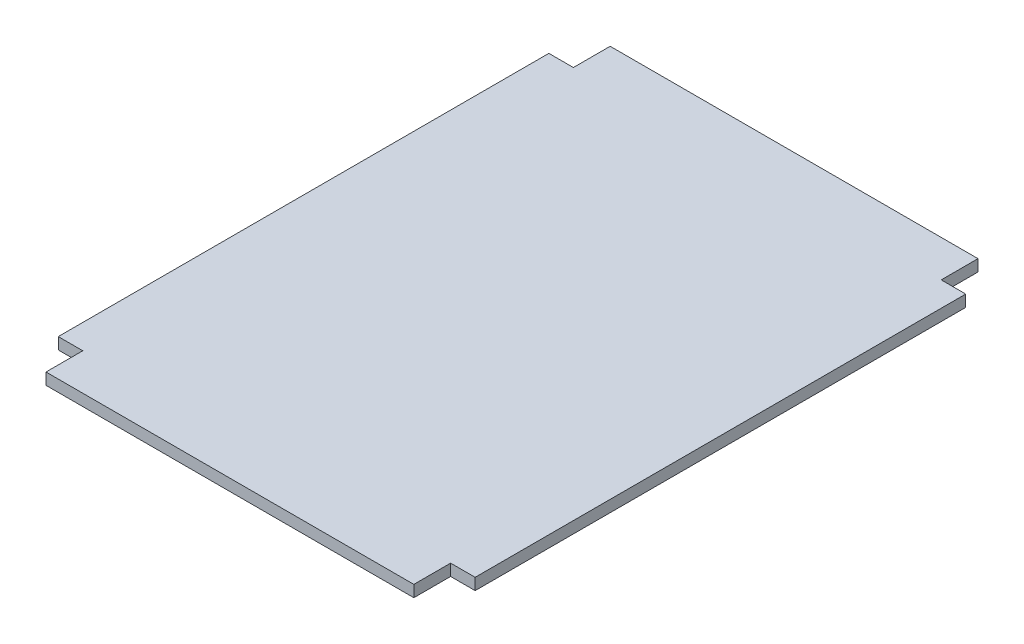
ISO-10303-21;
HEADER;
FILE_DESCRIPTION(('STEP AP214'),'2;1');
FILE_NAME('part.step','',(''),(''),'','','');
FILE_SCHEMA(('AUTOMOTIVE_DESIGN { 1 0 10303 214 1 1 1 1 }'));
ENDSEC;
DATA;
#1=APPLICATION_CONTEXT('core data for automotive mechanical design processes');
#2=APPLICATION_PROTOCOL_DEFINITION('international standard','automotive_design',2000,#1);
#3=PRODUCT_CONTEXT('',#1,'mechanical');
#4=PRODUCT('Part','Part','',(#3));
#5=PRODUCT_RELATED_PRODUCT_CATEGORY('part','',(#4));
#6=PRODUCT_DEFINITION_FORMATION('','',#4);
#7=PRODUCT_DEFINITION_CONTEXT('part definition',#1,'design');
#8=PRODUCT_DEFINITION('design','',#6,#7);
#9=PRODUCT_DEFINITION_SHAPE('','',#8);
#10=(LENGTH_UNIT() NAMED_UNIT(*) SI_UNIT(.MILLI.,.METRE.));
#11=(NAMED_UNIT(*) PLANE_ANGLE_UNIT() SI_UNIT($,.RADIAN.));
#12=(NAMED_UNIT(*) SI_UNIT($,.STERADIAN.) SOLID_ANGLE_UNIT());
#13=UNCERTAINTY_MEASURE_WITH_UNIT(LENGTH_MEASURE(1.E-05),#10,'distance_accuracy_value','');
#14=(GEOMETRIC_REPRESENTATION_CONTEXT(3) GLOBAL_UNCERTAINTY_ASSIGNED_CONTEXT((#13)) GLOBAL_UNIT_ASSIGNED_CONTEXT((#10,
#11,#12)) REPRESENTATION_CONTEXT('',''));
#15=CARTESIAN_POINT('',(0.,0.,0.));
#16=DIRECTION('',(0.,0.,1.));
#17=DIRECTION('',(1.,0.,0.));
#18=AXIS2_PLACEMENT_3D('',#15,#16,#17);
#19=CARTESIAN_POINT('',(0.,2.9972,-73.025));
#20=DIRECTION('',(0.,0.,1.));
#21=DIRECTION('',(1.,0.,0.));
#22=AXIS2_PLACEMENT_3D('',#19,#20,#21);
#23=PLANE('',#22);
#24=DIRECTION('',(-1.,0.,0.));
#25=VECTOR('',#24,1.);
#26=CARTESIAN_POINT('',(0.,0.,-73.025));
#27=LINE('',#26,#25);
#28=CARTESIAN_POINT('',(47.6123,0.,-73.025));
#29=VERTEX_POINT('',#28);
#30=CARTESIAN_POINT('',(-47.6122999999999,0.,-73.025));
#31=VERTEX_POINT('',#30);
#32=EDGE_CURVE('E156',#29,#31,#27,.T.);
#33=ORIENTED_EDGE('',*,*,#32,.T.);
#34=DIRECTION('',(0.,-1.,0.));
#35=VECTOR('',#34,1.);
#36=CARTESIAN_POINT('',(-47.6122999999999,2.9972,-73.025));
#37=LINE('',#36,#35);
#38=CARTESIAN_POINT('',(-47.6122999999999,2.9972,-73.025));
#39=VERTEX_POINT('',#38);
#40=EDGE_CURVE('E11',#39,#31,#37,.T.);
#41=ORIENTED_EDGE('',*,*,#40,.F.);
#42=DIRECTION('',(-1.,0.,0.));
#43=VECTOR('',#42,1.);
#44=CARTESIAN_POINT('',(0.,2.9972,-73.025));
#45=LINE('',#44,#43);
#46=CARTESIAN_POINT('',(47.6123,2.9972,-73.025));
#47=VERTEX_POINT('',#46);
#48=EDGE_CURVE('E188',#47,#39,#45,.T.);
#49=ORIENTED_EDGE('',*,*,#48,.F.);
#50=DIRECTION('',(0.,-1.,0.));
#51=VECTOR('',#50,1.);
#52=CARTESIAN_POINT('',(47.6123,2.9972,-73.025));
#53=LINE('',#52,#51);
#54=EDGE_CURVE('E52',#47,#29,#53,.T.);
#55=ORIENTED_EDGE('',*,*,#54,.T.);
#56=EDGE_LOOP('',(#33,#41,#49,#55));
#57=FACE_BOUND('',#56,.T.);
#58=ADVANCED_FACE('F36',(#57),#23,.F.);
#59=CARTESIAN_POINT('',(-47.6122999999999,2.9972,0.));
#60=DIRECTION('',(1.,0.,0.));
#61=DIRECTION('',(0.,0.,-1.));
#62=AXIS2_PLACEMENT_3D('',#59,#60,#61);
#63=PLANE('',#62);
#64=DIRECTION('',(0.,0.,1.));
#65=VECTOR('',#64,1.);
#66=CARTESIAN_POINT('',(-47.6122999999999,0.,0.));
#67=LINE('',#66,#65);
#68=CARTESIAN_POINT('',(-47.6122999999999,0.,-63.5));
#69=VERTEX_POINT('',#68);
#70=EDGE_CURVE('E158',#31,#69,#67,.T.);
#71=ORIENTED_EDGE('',*,*,#70,.T.);
#72=DIRECTION('',(0.,-1.,0.));
#73=VECTOR('',#72,1.);
#74=CARTESIAN_POINT('',(-47.6122999999999,2.9972,-63.5));
#75=LINE('',#74,#73);
#76=CARTESIAN_POINT('',(-47.6122999999999,2.9972,-63.5));
#77=VERTEX_POINT('',#76);
#78=EDGE_CURVE('E44',#77,#69,#75,.T.);
#79=ORIENTED_EDGE('',*,*,#78,.F.);
#80=DIRECTION('',(0.,0.,1.));
#81=VECTOR('',#80,1.);
#82=CARTESIAN_POINT('',(-47.6122999999999,2.9972,0.));
#83=LINE('',#82,#81);
#84=EDGE_CURVE('E103',#39,#77,#83,.T.);
#85=ORIENTED_EDGE('',*,*,#84,.F.);
#86=ORIENTED_EDGE('',*,*,#40,.T.);
#87=EDGE_LOOP('',(#71,#79,#85,#86));
#88=FACE_BOUND('',#87,.T.);
#89=ADVANCED_FACE('F209',(#88),#63,.F.);
#90=CARTESIAN_POINT('',(0.,2.9972,-63.5));
#91=DIRECTION('',(0.,0.,-1.));
#92=DIRECTION('',(-1.,0.,0.));
#93=AXIS2_PLACEMENT_3D('',#90,#91,#92);
#94=PLANE('',#93);
#95=DIRECTION('',(1.,0.,0.));
#96=VECTOR('',#95,1.);
#97=CARTESIAN_POINT('',(0.,0.,-63.5));
#98=LINE('',#97,#96);
#99=CARTESIAN_POINT('',(-53.9622999999999,0.,-63.5));
#100=VERTEX_POINT('',#99);
#101=EDGE_CURVE('E161',#100,#69,#98,.T.);
#102=ORIENTED_EDGE('',*,*,#101,.F.);
#103=DIRECTION('',(0.,-1.,0.));
#104=VECTOR('',#103,1.);
#105=CARTESIAN_POINT('',(-53.9622999999999,2.9972,-63.5));
#106=LINE('',#105,#104);
#107=CARTESIAN_POINT('',(-53.9622999999999,2.9972,-63.5));
#108=VERTEX_POINT('',#107);
#109=EDGE_CURVE('E202',#108,#100,#106,.T.);
#110=ORIENTED_EDGE('',*,*,#109,.F.);
#111=DIRECTION('',(1.,0.,0.));
#112=VECTOR('',#111,1.);
#113=CARTESIAN_POINT('',(0.,2.9972,-63.5));
#114=LINE('',#113,#112);
#115=EDGE_CURVE('E208',#108,#77,#114,.T.);
#116=ORIENTED_EDGE('',*,*,#115,.T.);
#117=ORIENTED_EDGE('',*,*,#78,.T.);
#118=EDGE_LOOP('',(#102,#110,#116,#117));
#119=FACE_BOUND('',#118,.T.);
#120=ADVANCED_FACE('F206',(#119),#94,.T.);
#121=CARTESIAN_POINT('',(-53.9622999999999,2.9972,0.));
#122=DIRECTION('',(-1.,0.,0.));
#123=DIRECTION('',(0.,0.,1.));
#124=AXIS2_PLACEMENT_3D('',#121,#122,#123);
#125=PLANE('',#124);
#126=DIRECTION('',(0.,0.,-1.));
#127=VECTOR('',#126,1.);
#128=CARTESIAN_POINT('',(-53.9622999999999,0.,0.));
#129=LINE('',#128,#127);
#130=CARTESIAN_POINT('',(-53.9622999999999,0.,63.5));
#131=VERTEX_POINT('',#130);
#132=EDGE_CURVE('E164',#131,#100,#129,.T.);
#133=ORIENTED_EDGE('',*,*,#132,.F.);
#134=DIRECTION('',(0.,-1.,0.));
#135=VECTOR('',#134,1.);
#136=CARTESIAN_POINT('',(-53.9622999999999,2.9972,63.5));
#137=LINE('',#136,#135);
#138=CARTESIAN_POINT('',(-53.9622999999999,2.9972,63.5));
#139=VERTEX_POINT('',#138);
#140=EDGE_CURVE('E200',#139,#131,#137,.T.);
#141=ORIENTED_EDGE('',*,*,#140,.F.);
#142=DIRECTION('',(0.,0.,-1.));
#143=VECTOR('',#142,1.);
#144=CARTESIAN_POINT('',(-53.9622999999999,2.9972,0.));
#145=LINE('',#144,#143);
#146=EDGE_CURVE('E220',#139,#108,#145,.T.);
#147=ORIENTED_EDGE('',*,*,#146,.T.);
#148=ORIENTED_EDGE('',*,*,#109,.T.);
#149=EDGE_LOOP('',(#133,#141,#147,#148));
#150=FACE_BOUND('',#149,.T.);
#151=ADVANCED_FACE('F216',(#150),#125,.T.);
#152=CARTESIAN_POINT('',(0.,2.9972,63.5));
#153=DIRECTION('',(0.,0.,-1.));
#154=DIRECTION('',(-1.,0.,0.));
#155=AXIS2_PLACEMENT_3D('',#152,#153,#154);
#156=PLANE('',#155);
#157=DIRECTION('',(1.,0.,0.));
#158=VECTOR('',#157,1.);
#159=CARTESIAN_POINT('',(0.,0.,63.5));
#160=LINE('',#159,#158);
#161=CARTESIAN_POINT('',(-47.6122999999999,0.,63.5));
#162=VERTEX_POINT('',#161);
#163=EDGE_CURVE('E167',#131,#162,#160,.T.);
#164=ORIENTED_EDGE('',*,*,#163,.T.);
#165=DIRECTION('',(0.,-1.,0.));
#166=VECTOR('',#165,1.);
#167=CARTESIAN_POINT('',(-47.6122999999999,2.9972,63.5));
#168=LINE('',#167,#166);
#169=CARTESIAN_POINT('',(-47.6122999999999,2.9972,63.5));
#170=VERTEX_POINT('',#169);
#171=EDGE_CURVE('E198',#170,#162,#168,.T.);
#172=ORIENTED_EDGE('',*,*,#171,.F.);
#173=DIRECTION('',(1.,0.,0.));
#174=VECTOR('',#173,1.);
#175=CARTESIAN_POINT('',(0.,2.9972,63.5));
#176=LINE('',#175,#174);
#177=EDGE_CURVE('E222',#139,#170,#176,.T.);
#178=ORIENTED_EDGE('',*,*,#177,.F.);
#179=ORIENTED_EDGE('',*,*,#140,.T.);
#180=EDGE_LOOP('',(#164,#172,#178,#179));
#181=FACE_BOUND('',#180,.T.);
#182=ADVANCED_FACE('F261',(#181),#156,.F.);
#183=CARTESIAN_POINT('',(-47.6122999999999,2.9972,0.));
#184=DIRECTION('',(-1.,0.,0.));
#185=DIRECTION('',(0.,0.,1.));
#186=AXIS2_PLACEMENT_3D('',#183,#184,#185);
#187=PLANE('',#186);
#188=DIRECTION('',(0.,0.,-1.));
#189=VECTOR('',#188,1.);
#190=CARTESIAN_POINT('',(-47.6122999999999,0.,0.));
#191=LINE('',#190,#189);
#192=CARTESIAN_POINT('',(-47.6122999999999,0.,73.025));
#193=VERTEX_POINT('',#192);
#194=EDGE_CURVE('E170',#193,#162,#191,.T.);
#195=ORIENTED_EDGE('',*,*,#194,.F.);
#196=DIRECTION('',(0.,-1.,0.));
#197=VECTOR('',#196,1.);
#198=CARTESIAN_POINT('',(-47.6122999999999,2.9972,73.025));
#199=LINE('',#198,#197);
#200=CARTESIAN_POINT('',(-47.6122999999999,2.9972,73.025));
#201=VERTEX_POINT('',#200);
#202=EDGE_CURVE('E196',#201,#193,#199,.T.);
#203=ORIENTED_EDGE('',*,*,#202,.F.);
#204=DIRECTION('',(0.,0.,-1.));
#205=VECTOR('',#204,1.);
#206=CARTESIAN_POINT('',(-47.6122999999999,2.9972,0.));
#207=LINE('',#206,#205);
#208=EDGE_CURVE('E228',#201,#170,#207,.T.);
#209=ORIENTED_EDGE('',*,*,#208,.T.);
#210=ORIENTED_EDGE('',*,*,#171,.T.);
#211=EDGE_LOOP('',(#195,#203,#209,#210));
#212=FACE_BOUND('',#211,.T.);
#213=ADVANCED_FACE('F264',(#212),#187,.T.);
#214=CARTESIAN_POINT('',(0.,2.9972,73.025));
#215=DIRECTION('',(0.,0.,1.));
#216=DIRECTION('',(1.,0.,0.));
#217=AXIS2_PLACEMENT_3D('',#214,#215,#216);
#218=PLANE('',#217);
#219=DIRECTION('',(-1.,0.,0.));
#220=VECTOR('',#219,1.);
#221=CARTESIAN_POINT('',(0.,0.,73.025));
#222=LINE('',#221,#220);
#223=CARTESIAN_POINT('',(47.6123000000001,0.,73.025));
#224=VERTEX_POINT('',#223);
#225=EDGE_CURVE('E173',#224,#193,#222,.T.);
#226=ORIENTED_EDGE('',*,*,#225,.F.);
#227=DIRECTION('',(0.,-1.,0.));
#228=VECTOR('',#227,1.);
#229=CARTESIAN_POINT('',(47.6123000000001,2.9972,73.025));
#230=LINE('',#229,#228);
#231=CARTESIAN_POINT('',(47.6123000000001,2.9972,73.025));
#232=VERTEX_POINT('',#231);
#233=EDGE_CURVE('E194',#232,#224,#230,.T.);
#234=ORIENTED_EDGE('',*,*,#233,.F.);
#235=DIRECTION('',(-1.,0.,0.));
#236=VECTOR('',#235,1.);
#237=CARTESIAN_POINT('',(0.,2.9972,73.025));
#238=LINE('',#237,#236);
#239=EDGE_CURVE('E231',#232,#201,#238,.T.);
#240=ORIENTED_EDGE('',*,*,#239,.T.);
#241=ORIENTED_EDGE('',*,*,#202,.T.);
#242=EDGE_LOOP('',(#226,#234,#240,#241));
#243=FACE_BOUND('',#242,.T.);
#244=ADVANCED_FACE('F268',(#243),#218,.T.);
#245=CARTESIAN_POINT('',(47.6123000000001,2.9972,0.));
#246=DIRECTION('',(-1.,0.,0.));
#247=DIRECTION('',(0.,0.,1.));
#248=AXIS2_PLACEMENT_3D('',#245,#246,#247);
#249=PLANE('',#248);
#250=DIRECTION('',(0.,0.,-1.));
#251=VECTOR('',#250,1.);
#252=CARTESIAN_POINT('',(47.6123000000001,0.,0.));
#253=LINE('',#252,#251);
#254=CARTESIAN_POINT('',(47.6123000000001,0.,63.5));
#255=VERTEX_POINT('',#254);
#256=EDGE_CURVE('E176',#224,#255,#253,.T.);
#257=ORIENTED_EDGE('',*,*,#256,.T.);
#258=DIRECTION('',(0.,-1.,0.));
#259=VECTOR('',#258,1.);
#260=CARTESIAN_POINT('',(47.6123000000001,2.9972,63.5));
#261=LINE('',#260,#259);
#262=CARTESIAN_POINT('',(47.6123000000001,2.9972,63.5));
#263=VERTEX_POINT('',#262);
#264=EDGE_CURVE('E192',#263,#255,#261,.T.);
#265=ORIENTED_EDGE('',*,*,#264,.F.);
#266=DIRECTION('',(0.,0.,-1.));
#267=VECTOR('',#266,1.);
#268=CARTESIAN_POINT('',(47.6123000000001,2.9972,0.));
#269=LINE('',#268,#267);
#270=EDGE_CURVE('E234',#232,#263,#269,.T.);
#271=ORIENTED_EDGE('',*,*,#270,.F.);
#272=ORIENTED_EDGE('',*,*,#233,.T.);
#273=EDGE_LOOP('',(#257,#265,#271,#272));
#274=FACE_BOUND('',#273,.T.);
#275=ADVANCED_FACE('F272',(#274),#249,.F.);
#276=CARTESIAN_POINT('',(0.,2.9972,63.5));
#277=DIRECTION('',(0.,0.,1.));
#278=DIRECTION('',(1.,0.,0.));
#279=AXIS2_PLACEMENT_3D('',#276,#277,#278);
#280=PLANE('',#279);
#281=DIRECTION('',(-1.,0.,0.));
#282=VECTOR('',#281,1.);
#283=CARTESIAN_POINT('',(0.,0.,63.5));
#284=LINE('',#283,#282);
#285=CARTESIAN_POINT('',(53.9623000000001,0.,63.5));
#286=VERTEX_POINT('',#285);
#287=EDGE_CURVE('E179',#286,#255,#284,.T.);
#288=ORIENTED_EDGE('',*,*,#287,.F.);
#289=DIRECTION('',(0.,-1.,0.));
#290=VECTOR('',#289,1.);
#291=CARTESIAN_POINT('',(53.9623000000001,2.9972,63.5));
#292=LINE('',#291,#290);
#293=CARTESIAN_POINT('',(53.9623000000001,2.9972,63.5));
#294=VERTEX_POINT('',#293);
#295=EDGE_CURVE('E148',#294,#286,#292,.T.);
#296=ORIENTED_EDGE('',*,*,#295,.F.);
#297=DIRECTION('',(-1.,0.,0.));
#298=VECTOR('',#297,1.);
#299=CARTESIAN_POINT('',(0.,2.9972,63.5));
#300=LINE('',#299,#298);
#301=EDGE_CURVE('E138',#294,#263,#300,.T.);
#302=ORIENTED_EDGE('',*,*,#301,.T.);
#303=ORIENTED_EDGE('',*,*,#264,.T.);
#304=EDGE_LOOP('',(#288,#296,#302,#303));
#305=FACE_BOUND('',#304,.T.);
#306=ADVANCED_FACE('F237',(#305),#280,.T.);
#307=CARTESIAN_POINT('',(53.9623000000001,2.9972,0.));
#308=DIRECTION('',(-1.,0.,0.));
#309=DIRECTION('',(0.,0.,1.));
#310=AXIS2_PLACEMENT_3D('',#307,#308,#309);
#311=PLANE('',#310);
#312=DIRECTION('',(0.,0.,-1.));
#313=VECTOR('',#312,1.);
#314=CARTESIAN_POINT('',(53.9623000000001,0.,0.));
#315=LINE('',#314,#313);
#316=CARTESIAN_POINT('',(53.9623000000001,0.,-63.5));
#317=VERTEX_POINT('',#316);
#318=EDGE_CURVE('E145',#286,#317,#315,.T.);
#319=ORIENTED_EDGE('',*,*,#318,.T.);
#320=DIRECTION('',(0.,-1.,0.));
#321=VECTOR('',#320,1.);
#322=CARTESIAN_POINT('',(53.9623000000001,2.9972,-63.5));
#323=LINE('',#322,#321);
#324=CARTESIAN_POINT('',(53.9623000000001,2.9972,-63.5));
#325=VERTEX_POINT('',#324);
#326=EDGE_CURVE('E142',#325,#317,#323,.T.);
#327=ORIENTED_EDGE('',*,*,#326,.F.);
#328=DIRECTION('',(0.,0.,-1.));
#329=VECTOR('',#328,1.);
#330=CARTESIAN_POINT('',(53.9623000000001,2.9972,0.));
#331=LINE('',#330,#329);
#332=EDGE_CURVE('E131',#294,#325,#331,.T.);
#333=ORIENTED_EDGE('',*,*,#332,.F.);
#334=ORIENTED_EDGE('',*,*,#295,.T.);
#335=EDGE_LOOP('',(#319,#327,#333,#334));
#336=FACE_BOUND('',#335,.T.);
#337=ADVANCED_FACE('F143',(#336),#311,.F.);
#338=CARTESIAN_POINT('',(0.,2.9972,-63.5));
#339=DIRECTION('',(0.,0.,1.));
#340=DIRECTION('',(1.,0.,0.));
#341=AXIS2_PLACEMENT_3D('',#338,#339,#340);
#342=PLANE('',#341);
#343=DIRECTION('',(-1.,0.,0.));
#344=VECTOR('',#343,1.);
#345=CARTESIAN_POINT('',(0.,0.,-63.5));
#346=LINE('',#345,#344);
#347=CARTESIAN_POINT('',(47.6123000000001,0.,-63.5));
#348=VERTEX_POINT('',#347);
#349=EDGE_CURVE('E183',#317,#348,#346,.T.);
#350=ORIENTED_EDGE('',*,*,#349,.T.);
#351=DIRECTION('',(0.,-1.,0.));
#352=VECTOR('',#351,1.);
#353=CARTESIAN_POINT('',(47.6123000000001,2.9972,-63.5));
#354=LINE('',#353,#352);
#355=CARTESIAN_POINT('',(47.6123000000001,2.9972,-63.5));
#356=VERTEX_POINT('',#355);
#357=EDGE_CURVE('E91',#356,#348,#354,.T.);
#358=ORIENTED_EDGE('',*,*,#357,.F.);
#359=DIRECTION('',(-1.,0.,0.));
#360=VECTOR('',#359,1.);
#361=CARTESIAN_POINT('',(0.,2.9972,-63.5));
#362=LINE('',#361,#360);
#363=EDGE_CURVE('E136',#325,#356,#362,.T.);
#364=ORIENTED_EDGE('',*,*,#363,.F.);
#365=ORIENTED_EDGE('',*,*,#326,.T.);
#366=EDGE_LOOP('',(#350,#358,#364,#365));
#367=FACE_BOUND('',#366,.T.);
#368=ADVANCED_FACE('F150',(#367),#342,.F.);
#369=CARTESIAN_POINT('',(47.6123000000001,2.9972,0.));
#370=DIRECTION('',(1.,0.,0.));
#371=DIRECTION('',(0.,0.,-1.));
#372=AXIS2_PLACEMENT_3D('',#369,#370,#371);
#373=PLANE('',#372);
#374=DIRECTION('',(0.,0.,1.));
#375=VECTOR('',#374,1.);
#376=CARTESIAN_POINT('',(47.6123000000001,0.,0.));
#377=LINE('',#376,#375);
#378=EDGE_CURVE('E185',#29,#348,#377,.T.);
#379=ORIENTED_EDGE('',*,*,#378,.F.);
#380=ORIENTED_EDGE('',*,*,#54,.F.);
#381=DIRECTION('',(0.,0.,1.));
#382=VECTOR('',#381,1.);
#383=CARTESIAN_POINT('',(47.6123000000001,2.9972,0.));
#384=LINE('',#383,#382);
#385=EDGE_CURVE('E151',#47,#356,#384,.T.);
#386=ORIENTED_EDGE('',*,*,#385,.T.);
#387=ORIENTED_EDGE('',*,*,#357,.T.);
#388=EDGE_LOOP('',(#379,#380,#386,#387));
#389=FACE_BOUND('',#388,.T.);
#390=ADVANCED_FACE('F240',(#389),#373,.T.);
#391=CARTESIAN_POINT('',(0.,2.9972,0.));
#392=DIRECTION('',(0.,1.,0.));
#393=DIRECTION('',(0.,0.,1.));
#394=AXIS2_PLACEMENT_3D('',#391,#392,#393);
#395=PLANE('',#394);
#396=ORIENTED_EDGE('',*,*,#48,.T.);
#397=ORIENTED_EDGE('',*,*,#84,.T.);
#398=ORIENTED_EDGE('',*,*,#115,.F.);
#399=ORIENTED_EDGE('',*,*,#146,.F.);
#400=ORIENTED_EDGE('',*,*,#177,.T.);
#401=ORIENTED_EDGE('',*,*,#208,.F.);
#402=ORIENTED_EDGE('',*,*,#239,.F.);
#403=ORIENTED_EDGE('',*,*,#270,.T.);
#404=ORIENTED_EDGE('',*,*,#301,.F.);
#405=ORIENTED_EDGE('',*,*,#332,.T.);
#406=ORIENTED_EDGE('',*,*,#363,.T.);
#407=ORIENTED_EDGE('',*,*,#385,.F.);
#408=EDGE_LOOP('',(#396,#397,#398,#399,#400,#401,#402,#403,#404,#405,#406,#407));
#409=FACE_BOUND('',#408,.T.);
#410=ADVANCED_FACE('F133',(#409),#395,.T.);
#411=CARTESIAN_POINT('',(0.,0.,0.));
#412=DIRECTION('',(0.,1.,0.));
#413=DIRECTION('',(0.,0.,1.));
#414=AXIS2_PLACEMENT_3D('',#411,#412,#413);
#415=PLANE('',#414);
#416=ORIENTED_EDGE('',*,*,#32,.F.);
#417=ORIENTED_EDGE('',*,*,#378,.T.);
#418=ORIENTED_EDGE('',*,*,#349,.F.);
#419=ORIENTED_EDGE('',*,*,#318,.F.);
#420=ORIENTED_EDGE('',*,*,#287,.T.);
#421=ORIENTED_EDGE('',*,*,#256,.F.);
#422=ORIENTED_EDGE('',*,*,#225,.T.);
#423=ORIENTED_EDGE('',*,*,#194,.T.);
#424=ORIENTED_EDGE('',*,*,#163,.F.);
#425=ORIENTED_EDGE('',*,*,#132,.T.);
#426=ORIENTED_EDGE('',*,*,#101,.T.);
#427=ORIENTED_EDGE('',*,*,#70,.F.);
#428=EDGE_LOOP('',(#416,#417,#418,#419,#420,#421,#422,#423,#424,#425,#426,#427));
#429=FACE_BOUND('',#428,.T.);
#430=ADVANCED_FACE('F212',(#429),#415,.F.);
#431=CLOSED_SHELL('',(#58,#89,#120,#151,#182,#213,#244,#275,#306,#337,#368,#390,#410,#430));
#432=MANIFOLD_SOLID_BREP('B2',#431);
#433=ADVANCED_BREP_SHAPE_REPRESENTATION('',(#18,#432),#14);
#434=SHAPE_DEFINITION_REPRESENTATION(#9,#433);
ENDSEC;
END-ISO-10303-21;
